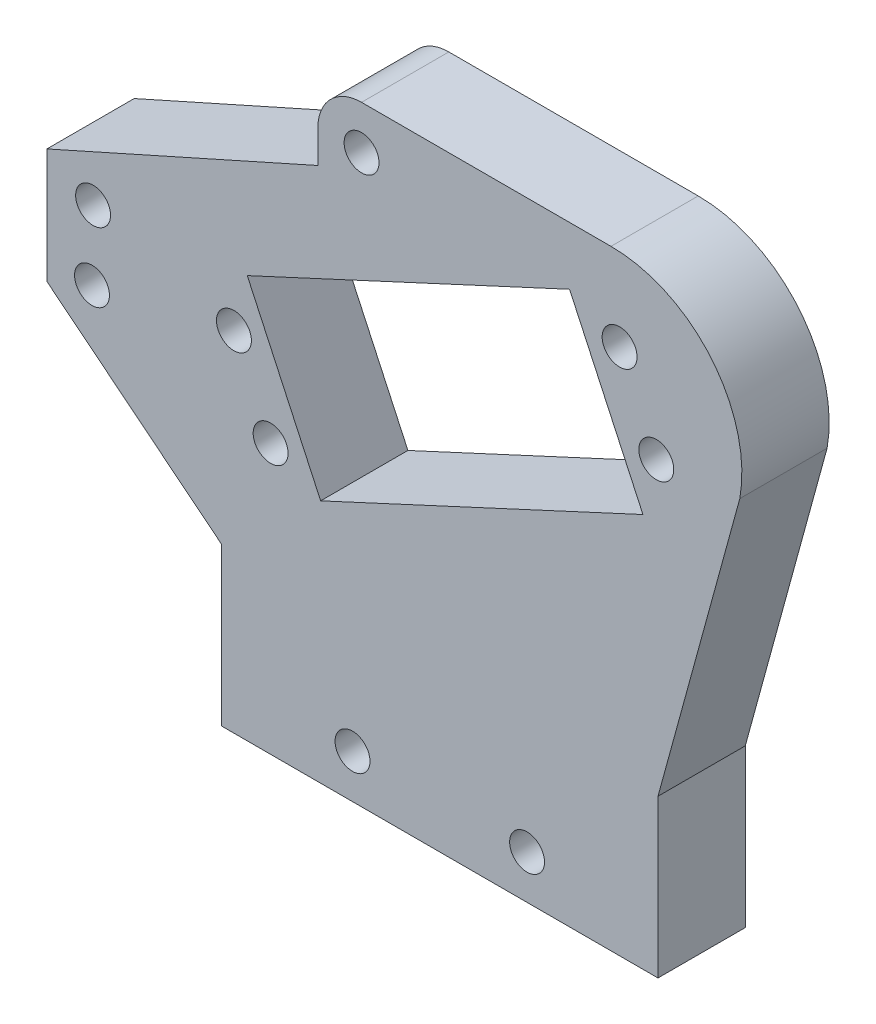
ISO-10303-21;
HEADER;
FILE_DESCRIPTION(('STEP AP214'),'2;1');
FILE_NAME('part.step','',(''),(''),'','','');
FILE_SCHEMA(('AUTOMOTIVE_DESIGN { 1 0 10303 214 1 1 1 1 }'));
ENDSEC;
DATA;
#1=APPLICATION_CONTEXT('core data for automotive mechanical design processes');
#2=APPLICATION_PROTOCOL_DEFINITION('international standard','automotive_design',2000,#1);
#3=PRODUCT_CONTEXT('',#1,'mechanical');
#4=PRODUCT('Part','Part','',(#3));
#5=PRODUCT_RELATED_PRODUCT_CATEGORY('part','',(#4));
#6=PRODUCT_DEFINITION_FORMATION('','',#4);
#7=PRODUCT_DEFINITION_CONTEXT('part definition',#1,'design');
#8=PRODUCT_DEFINITION('design','',#6,#7);
#9=PRODUCT_DEFINITION_SHAPE('','',#8);
#10=(LENGTH_UNIT() NAMED_UNIT(*) SI_UNIT(.MILLI.,.METRE.));
#11=(NAMED_UNIT(*) PLANE_ANGLE_UNIT() SI_UNIT($,.RADIAN.));
#12=(NAMED_UNIT(*) SI_UNIT($,.STERADIAN.) SOLID_ANGLE_UNIT());
#13=UNCERTAINTY_MEASURE_WITH_UNIT(LENGTH_MEASURE(1.E-05),#10,'distance_accuracy_value','');
#14=(GEOMETRIC_REPRESENTATION_CONTEXT(3) GLOBAL_UNCERTAINTY_ASSIGNED_CONTEXT((#13)) GLOBAL_UNIT_ASSIGNED_CONTEXT((#10,
#11,#12)) REPRESENTATION_CONTEXT('',''));
#15=CARTESIAN_POINT('',(0.,0.,0.));
#16=DIRECTION('',(0.,0.,1.));
#17=DIRECTION('',(1.,0.,0.));
#18=AXIS2_PLACEMENT_3D('',#15,#16,#17);
#19=CARTESIAN_POINT('',(0.,-50.,10.));
#20=DIRECTION('',(0.,-1.,0.));
#21=DIRECTION('',(1.,0.,0.));
#22=AXIS2_PLACEMENT_3D('',#19,#20,#21);
#23=PLANE('',#22);
#24=DIRECTION('',(-1.,0.,0.));
#25=VECTOR('',#24,1.);
#26=CARTESIAN_POINT('',(0.,-50.,0.));
#27=LINE('',#26,#25);
#28=CARTESIAN_POINT('',(15.,-50.,0.));
#29=VERTEX_POINT('',#28);
#30=CARTESIAN_POINT('',(-35.,-50.,0.));
#31=VERTEX_POINT('',#30);
#32=EDGE_CURVE('E174',#29,#31,#27,.T.);
#33=ORIENTED_EDGE('',*,*,#32,.F.);
#34=DIRECTION('',(0.,0.,-1.));
#35=VECTOR('',#34,1.);
#36=CARTESIAN_POINT('',(15.,-50.,10.));
#37=LINE('',#36,#35);
#38=CARTESIAN_POINT('',(15.,-50.,10.));
#39=VERTEX_POINT('',#38);
#40=EDGE_CURVE('E11',#39,#29,#37,.T.);
#41=ORIENTED_EDGE('',*,*,#40,.F.);
#42=DIRECTION('',(-1.,0.,0.));
#43=VECTOR('',#42,1.);
#44=CARTESIAN_POINT('',(0.,-50.,10.));
#45=LINE('',#44,#43);
#46=CARTESIAN_POINT('',(-35.,-50.,10.));
#47=VERTEX_POINT('',#46);
#48=EDGE_CURVE('E178',#39,#47,#45,.T.);
#49=ORIENTED_EDGE('',*,*,#48,.T.);
#50=DIRECTION('',(0.,0.,-1.));
#51=VECTOR('',#50,1.);
#52=CARTESIAN_POINT('',(-35.,-50.,10.));
#53=LINE('',#52,#51);
#54=EDGE_CURVE('E225',#47,#31,#53,.T.);
#55=ORIENTED_EDGE('',*,*,#54,.T.);
#56=EDGE_LOOP('',(#33,#41,#49,#55));
#57=FACE_BOUND('',#56,.T.);
#58=ADVANCED_FACE('F34',(#57),#23,.T.);
#59=CARTESIAN_POINT('',(15.,0.,10.));
#60=DIRECTION('',(-1.,0.,0.));
#61=DIRECTION('',(0.,0.,1.));
#62=AXIS2_PLACEMENT_3D('',#59,#60,#61);
#63=PLANE('',#62);
#64=DIRECTION('',(0.,1.,0.));
#65=VECTOR('',#64,1.);
#66=CARTESIAN_POINT('',(15.,0.,0.));
#67=LINE('',#66,#65);
#68=CARTESIAN_POINT('',(15.,-31.9648900169205,0.));
#69=VERTEX_POINT('',#68);
#70=EDGE_CURVE('E228',#29,#69,#67,.T.);
#71=ORIENTED_EDGE('',*,*,#70,.T.);
#72=DIRECTION('',(0.,0.,-1.));
#73=VECTOR('',#72,1.);
#74=CARTESIAN_POINT('',(15.,-31.9648900169205,10.));
#75=LINE('',#74,#73);
#76=CARTESIAN_POINT('',(15.,-31.9648900169205,10.));
#77=VERTEX_POINT('',#76);
#78=EDGE_CURVE('E41',#77,#69,#75,.T.);
#79=ORIENTED_EDGE('',*,*,#78,.F.);
#80=DIRECTION('',(0.,1.,0.));
#81=VECTOR('',#80,1.);
#82=CARTESIAN_POINT('',(15.,0.,10.));
#83=LINE('',#82,#81);
#84=EDGE_CURVE('E181',#39,#77,#83,.T.);
#85=ORIENTED_EDGE('',*,*,#84,.F.);
#86=ORIENTED_EDGE('',*,*,#40,.T.);
#87=EDGE_LOOP('',(#71,#79,#85,#86));
#88=FACE_BOUND('',#87,.T.);
#89=ADVANCED_FACE('F336',(#88),#63,.F.);
#90=CARTESIAN_POINT('',(22.0984528948861,-6.05401504575989,10.));
#91=DIRECTION('',(-0.964462241959494,0.264220710457123,0.));
#92=DIRECTION('',(-0.264220710457123,-0.964462241959494,0.));
#93=AXIS2_PLACEMENT_3D('',#90,#91,#92);
#94=PLANE('',#93);
#95=DIRECTION('',(0.264220710457123,0.964462241959494,0.));
#96=VECTOR('',#95,1.);
#97=CARTESIAN_POINT('',(22.0984528948861,-6.05401504575989,0.));
#98=LINE('',#97,#96);
#99=CARTESIAN_POINT('',(24.3763071489283,2.26064135233112,0.));
#100=VERTEX_POINT('',#99);
#101=EDGE_CURVE('E230',#69,#100,#98,.T.);
#102=ORIENTED_EDGE('',*,*,#101,.T.);
#103=DIRECTION('',(0.,0.,-1.));
#104=VECTOR('',#103,1.);
#105=CARTESIAN_POINT('',(24.3763071489283,2.26064135233112,10.));
#106=LINE('',#105,#104);
#107=CARTESIAN_POINT('',(24.3763071489283,2.26064135233112,10.));
#108=VERTEX_POINT('',#107);
#109=EDGE_CURVE('E286',#108,#100,#106,.T.);
#110=ORIENTED_EDGE('',*,*,#109,.F.);
#111=DIRECTION('',(0.264220710457123,0.964462241959494,0.));
#112=VECTOR('',#111,1.);
#113=CARTESIAN_POINT('',(22.0984528948861,-6.05401504575989,10.));
#114=LINE('',#113,#112);
#115=EDGE_CURVE('E184',#77,#108,#114,.T.);
#116=ORIENTED_EDGE('',*,*,#115,.F.);
#117=ORIENTED_EDGE('',*,*,#78,.T.);
#118=EDGE_LOOP('',(#102,#110,#116,#117));
#119=FACE_BOUND('',#118,.T.);
#120=ADVANCED_FACE('F292',(#119),#94,.F.);
#121=CARTESIAN_POINT('',(9.61205201568624,4.90956006768191,10.));
#122=DIRECTION('',(0.,0.,-1.));
#123=DIRECTION('',(-1.,0.,0.));
#124=AXIS2_PLACEMENT_3D('',#121,#122,#123);
#125=CYLINDRICAL_SURFACE('',#124,15.);
#126=CARTESIAN_POINT('',(9.61205201568624,4.90956006768191,0.));
#127=DIRECTION('',(0.,0.,1.));
#128=DIRECTION('',(1.,0.,0.));
#129=AXIS2_PLACEMENT_3D('',#126,#127,#128);
#130=CIRCLE('',#129,15.);
#131=CARTESIAN_POINT('',(9.61205201568612,19.9095600676819,0.));
#132=VERTEX_POINT('',#131);
#133=EDGE_CURVE('E233',#132,#100,#130,.F.);
#134=ORIENTED_EDGE('',*,*,#133,.F.);
#135=DIRECTION('',(0.,0.,-1.));
#136=VECTOR('',#135,1.);
#137=CARTESIAN_POINT('',(9.61205201568612,19.9095600676819,10.));
#138=LINE('',#137,#136);
#139=CARTESIAN_POINT('',(9.61205201568612,19.9095600676819,10.));
#140=VERTEX_POINT('',#139);
#141=EDGE_CURVE('E284',#140,#132,#138,.T.);
#142=ORIENTED_EDGE('',*,*,#141,.F.);
#143=CARTESIAN_POINT('',(9.61205201568624,4.90956006768191,10.));
#144=DIRECTION('',(0.,0.,1.));
#145=DIRECTION('',(1.,0.,0.));
#146=AXIS2_PLACEMENT_3D('',#143,#144,#145);
#147=CIRCLE('',#146,15.);
#148=EDGE_CURVE('E186',#140,#108,#147,.F.);
#149=ORIENTED_EDGE('',*,*,#148,.T.);
#150=ORIENTED_EDGE('',*,*,#109,.T.);
#151=EDGE_LOOP('',(#134,#142,#149,#150));
#152=FACE_BOUND('',#151,.T.);
#153=ADVANCED_FACE('F302',(#152),#125,.T.);
#154=CARTESIAN_POINT('',(0.,19.9095600676819,10.));
#155=DIRECTION('',(0.,1.,0.));
#156=DIRECTION('',(0.,0.,1.));
#157=AXIS2_PLACEMENT_3D('',#154,#155,#156);
#158=PLANE('',#157);
#159=DIRECTION('',(1.,0.,0.));
#160=VECTOR('',#159,1.);
#161=CARTESIAN_POINT('',(0.,19.9095600676819,0.));
#162=LINE('',#161,#160);
#163=CARTESIAN_POINT('',(-18.966361252115,19.9095600676819,0.));
#164=VERTEX_POINT('',#163);
#165=EDGE_CURVE('E236',#164,#132,#162,.T.);
#166=ORIENTED_EDGE('',*,*,#165,.F.);
#167=DIRECTION('',(0.,0.,-1.));
#168=VECTOR('',#167,1.);
#169=CARTESIAN_POINT('',(-18.966361252115,19.9095600676819,10.));
#170=LINE('',#169,#168);
#171=CARTESIAN_POINT('',(-18.966361252115,19.9095600676819,10.));
#172=VERTEX_POINT('',#171);
#173=EDGE_CURVE('E282',#172,#164,#170,.T.);
#174=ORIENTED_EDGE('',*,*,#173,.F.);
#175=DIRECTION('',(1.,0.,0.));
#176=VECTOR('',#175,1.);
#177=CARTESIAN_POINT('',(0.,19.9095600676819,10.));
#178=LINE('',#177,#176);
#179=EDGE_CURVE('E189',#172,#140,#178,.T.);
#180=ORIENTED_EDGE('',*,*,#179,.T.);
#181=ORIENTED_EDGE('',*,*,#141,.T.);
#182=EDGE_LOOP('',(#166,#174,#180,#181));
#183=FACE_BOUND('',#182,.T.);
#184=ADVANCED_FACE('F311',(#183),#158,.T.);
#185=CARTESIAN_POINT('',(-18.966361252115,14.9095600676819,10.));
#186=DIRECTION('',(0.,0.,-1.));
#187=DIRECTION('',(-1.,0.,0.));
#188=AXIS2_PLACEMENT_3D('',#185,#186,#187);
#189=CYLINDRICAL_SURFACE('',#188,5.);
#190=CARTESIAN_POINT('',(-18.966361252115,14.9095600676819,0.));
#191=DIRECTION('',(0.,0.,1.));
#192=DIRECTION('',(1.,0.,0.));
#193=AXIS2_PLACEMENT_3D('',#190,#191,#192);
#194=CIRCLE('',#193,5.);
#195=CARTESIAN_POINT('',(-23.966361252115,14.9095600676819,0.));
#196=VERTEX_POINT('',#195);
#197=EDGE_CURVE('E239',#196,#164,#194,.F.);
#198=ORIENTED_EDGE('',*,*,#197,.F.);
#199=DIRECTION('',(0.,0.,-1.));
#200=VECTOR('',#199,1.);
#201=CARTESIAN_POINT('',(-23.966361252115,14.9095600676819,10.));
#202=LINE('',#201,#200);
#203=CARTESIAN_POINT('',(-23.966361252115,14.9095600676819,10.));
#204=VERTEX_POINT('',#203);
#205=EDGE_CURVE('E280',#204,#196,#202,.T.);
#206=ORIENTED_EDGE('',*,*,#205,.F.);
#207=CARTESIAN_POINT('',(-18.966361252115,14.9095600676819,10.));
#208=DIRECTION('',(0.,0.,1.));
#209=DIRECTION('',(1.,0.,0.));
#210=AXIS2_PLACEMENT_3D('',#207,#208,#209);
#211=CIRCLE('',#210,5.);
#212=EDGE_CURVE('E192',#204,#172,#211,.F.);
#213=ORIENTED_EDGE('',*,*,#212,.T.);
#214=ORIENTED_EDGE('',*,*,#173,.T.);
#215=EDGE_LOOP('',(#198,#206,#213,#214));
#216=FACE_BOUND('',#215,.T.);
#217=ADVANCED_FACE('F314',(#216),#189,.T.);
#218=CARTESIAN_POINT('',(-23.966361252115,0.,10.));
#219=DIRECTION('',(-1.,0.,0.));
#220=DIRECTION('',(0.,0.,1.));
#221=AXIS2_PLACEMENT_3D('',#218,#219,#220);
#222=PLANE('',#221);
#223=DIRECTION('',(0.,1.,0.));
#224=VECTOR('',#223,1.);
#225=CARTESIAN_POINT('',(-23.966361252115,0.,0.));
#226=LINE('',#225,#224);
#227=CARTESIAN_POINT('',(-23.966361252115,11.1420473773266,0.));
#228=VERTEX_POINT('',#227);
#229=EDGE_CURVE('E242',#228,#196,#226,.T.);
#230=ORIENTED_EDGE('',*,*,#229,.F.);
#231=DIRECTION('',(0.,0.,-1.));
#232=VECTOR('',#231,1.);
#233=CARTESIAN_POINT('',(-23.966361252115,11.1420473773266,10.));
#234=LINE('',#233,#232);
#235=CARTESIAN_POINT('',(-23.966361252115,11.1420473773266,10.));
#236=VERTEX_POINT('',#235);
#237=EDGE_CURVE('E278',#236,#228,#234,.T.);
#238=ORIENTED_EDGE('',*,*,#237,.F.);
#239=DIRECTION('',(0.,1.,0.));
#240=VECTOR('',#239,1.);
#241=CARTESIAN_POINT('',(-23.966361252115,0.,10.));
#242=LINE('',#241,#240);
#243=EDGE_CURVE('E195',#236,#204,#242,.T.);
#244=ORIENTED_EDGE('',*,*,#243,.T.);
#245=ORIENTED_EDGE('',*,*,#205,.T.);
#246=EDGE_LOOP('',(#230,#238,#244,#245));
#247=FACE_BOUND('',#246,.T.);
#248=ADVANCED_FACE('F319',(#247),#222,.T.);
#249=CARTESIAN_POINT('',(-8.1435273591901,18.2157848823989,10.));
#250=DIRECTION('',(-0.408130541250124,0.912923579112119,0.));
#251=DIRECTION('',(-0.912923579112119,-0.408130541250124,0.));
#252=AXIS2_PLACEMENT_3D('',#249,#250,#251);
#253=PLANE('',#252);
#254=DIRECTION('',(0.912923579112119,0.408130541250124,0.));
#255=VECTOR('',#254,1.);
#256=CARTESIAN_POINT('',(-8.1435273591901,18.2157848823989,0.));
#257=LINE('',#256,#255);
#258=CARTESIAN_POINT('',(-55.0179686971235,-2.73984771573603,0.));
#259=VERTEX_POINT('',#258);
#260=EDGE_CURVE('E245',#259,#228,#257,.T.);
#261=ORIENTED_EDGE('',*,*,#260,.F.);
#262=DIRECTION('',(0.,0.,-1.));
#263=VECTOR('',#262,1.);
#264=CARTESIAN_POINT('',(-55.0179686971235,-2.73984771573603,10.));
#265=LINE('',#264,#263);
#266=CARTESIAN_POINT('',(-55.0179686971235,-2.73984771573603,10.));
#267=VERTEX_POINT('',#266);
#268=EDGE_CURVE('E276',#267,#259,#265,.T.);
#269=ORIENTED_EDGE('',*,*,#268,.F.);
#270=DIRECTION('',(0.912923579112119,0.408130541250124,0.));
#271=VECTOR('',#270,1.);
#272=CARTESIAN_POINT('',(-8.1435273591901,18.2157848823989,10.));
#273=LINE('',#272,#271);
#274=EDGE_CURVE('E198',#267,#236,#273,.T.);
#275=ORIENTED_EDGE('',*,*,#274,.T.);
#276=ORIENTED_EDGE('',*,*,#237,.T.);
#277=EDGE_LOOP('',(#261,#269,#275,#276));
#278=FACE_BOUND('',#277,.T.);
#279=ADVANCED_FACE('F322',(#278),#253,.T.);
#280=CARTESIAN_POINT('',(-55.0179686971235,0.,10.));
#281=DIRECTION('',(-1.,0.,0.));
#282=DIRECTION('',(0.,0.,1.));
#283=AXIS2_PLACEMENT_3D('',#280,#281,#282);
#284=PLANE('',#283);
#285=DIRECTION('',(0.,1.,0.));
#286=VECTOR('',#285,1.);
#287=CARTESIAN_POINT('',(-55.0179686971235,0.,0.));
#288=LINE('',#287,#286);
#289=CARTESIAN_POINT('',(-55.0179686971235,-15.891116751269,0.));
#290=VERTEX_POINT('',#289);
#291=EDGE_CURVE('E248',#290,#259,#288,.T.);
#292=ORIENTED_EDGE('',*,*,#291,.F.);
#293=DIRECTION('',(0.,0.,-1.));
#294=VECTOR('',#293,1.);
#295=CARTESIAN_POINT('',(-55.0179686971235,-15.891116751269,10.));
#296=LINE('',#295,#294);
#297=CARTESIAN_POINT('',(-55.0179686971235,-15.891116751269,10.));
#298=VERTEX_POINT('',#297);
#299=EDGE_CURVE('E274',#298,#290,#296,.T.);
#300=ORIENTED_EDGE('',*,*,#299,.F.);
#301=DIRECTION('',(0.,1.,0.));
#302=VECTOR('',#301,1.);
#303=CARTESIAN_POINT('',(-55.0179686971235,0.,10.));
#304=LINE('',#303,#302);
#305=EDGE_CURVE('E201',#298,#267,#304,.T.);
#306=ORIENTED_EDGE('',*,*,#305,.T.);
#307=ORIENTED_EDGE('',*,*,#268,.T.);
#308=EDGE_LOOP('',(#292,#300,#306,#307));
#309=FACE_BOUND('',#308,.T.);
#310=ADVANCED_FACE('F327',(#309),#284,.T.);
#311=CARTESIAN_POINT('',(-29.32545745957,-36.5213618328781,10.));
#312=DIRECTION('',(-0.626104808452477,-0.779738910682728,0.));
#313=DIRECTION('',(0.779738910682728,-0.626104808452477,0.));
#314=AXIS2_PLACEMENT_3D('',#311,#312,#313);
#315=PLANE('',#314);
#316=DIRECTION('',(-0.779738910682728,0.626104808452477,0.));
#317=VECTOR('',#316,1.);
#318=CARTESIAN_POINT('',(-29.32545745957,-36.5213618328781,0.));
#319=LINE('',#318,#317);
#320=CARTESIAN_POINT('',(-35.,-31.9648900169205,0.));
#321=VERTEX_POINT('',#320);
#322=EDGE_CURVE('E251',#321,#290,#319,.T.);
#323=ORIENTED_EDGE('',*,*,#322,.F.);
#324=DIRECTION('',(0.,0.,-1.));
#325=VECTOR('',#324,1.);
#326=CARTESIAN_POINT('',(-35.,-31.9648900169205,10.));
#327=LINE('',#326,#325);
#328=CARTESIAN_POINT('',(-35.,-31.9648900169205,10.));
#329=VERTEX_POINT('',#328);
#330=EDGE_CURVE('E272',#329,#321,#327,.T.);
#331=ORIENTED_EDGE('',*,*,#330,.F.);
#332=DIRECTION('',(-0.779738910682728,0.626104808452477,0.));
#333=VECTOR('',#332,1.);
#334=CARTESIAN_POINT('',(-29.32545745957,-36.5213618328781,10.));
#335=LINE('',#334,#333);
#336=EDGE_CURVE('E204',#329,#298,#335,.T.);
#337=ORIENTED_EDGE('',*,*,#336,.T.);
#338=ORIENTED_EDGE('',*,*,#299,.T.);
#339=EDGE_LOOP('',(#323,#331,#337,#338));
#340=FACE_BOUND('',#339,.T.);
#341=ADVANCED_FACE('F330',(#340),#315,.T.);
#342=CARTESIAN_POINT('',(-49.7259072336343,-5.68993613292802,10.));
#343=DIRECTION('',(0.,0.,-1.));
#344=DIRECTION('',(-1.,0.,0.));
#345=AXIS2_PLACEMENT_3D('',#342,#343,#344);
#346=CYLINDRICAL_SURFACE('',#345,2.);
#347=CARTESIAN_POINT('',(-49.7259072336343,-5.68993613292802,10.));
#348=DIRECTION('',(0.,0.,1.));
#349=DIRECTION('',(1.,0.,0.));
#350=AXIS2_PLACEMENT_3D('',#347,#348,#349);
#351=CIRCLE('',#350,2.);
#352=CARTESIAN_POINT('',(-47.7259072336343,-5.68993613292802,10.));
#353=VERTEX_POINT('',#352);
#354=EDGE_CURVE('E219',#353,#353,#351,.T.);
#355=ORIENTED_EDGE('',*,*,#354,.T.);
#356=EDGE_LOOP('',(#355));
#357=FACE_BOUND('',#356,.T.);
#358=CARTESIAN_POINT('',(-49.7259072336343,-5.68993613292802,0.));
#359=DIRECTION('',(0.,0.,1.));
#360=DIRECTION('',(1.,0.,0.));
#361=AXIS2_PLACEMENT_3D('',#358,#359,#360);
#362=CIRCLE('',#361,2.);
#363=CARTESIAN_POINT('',(-47.7259072336343,-5.68993613292802,0.));
#364=VERTEX_POINT('',#363);
#365=EDGE_CURVE('E266',#364,#364,#362,.T.);
#366=ORIENTED_EDGE('',*,*,#365,.F.);
#367=EDGE_LOOP('',(#366));
#368=FACE_BOUND('',#367,.T.);
#369=ADVANCED_FACE('F358',(#357,#368),#346,.F.);
#370=CARTESIAN_POINT('',(-49.8507689611168,-13.6889616703926,10.));
#371=DIRECTION('',(0.,0.,-1.));
#372=DIRECTION('',(-1.,0.,0.));
#373=AXIS2_PLACEMENT_3D('',#370,#371,#372);
#374=CYLINDRICAL_SURFACE('',#373,2.);
#375=CARTESIAN_POINT('',(-49.8507689611168,-13.6889616703926,10.));
#376=DIRECTION('',(0.,0.,1.));
#377=DIRECTION('',(1.,0.,0.));
#378=AXIS2_PLACEMENT_3D('',#375,#376,#377);
#379=CIRCLE('',#378,2.);
#380=CARTESIAN_POINT('',(-47.8507689611168,-13.6889616703926,10.));
#381=VERTEX_POINT('',#380);
#382=EDGE_CURVE('E216',#381,#381,#379,.T.);
#383=ORIENTED_EDGE('',*,*,#382,.T.);
#384=EDGE_LOOP('',(#383));
#385=FACE_BOUND('',#384,.T.);
#386=CARTESIAN_POINT('',(-49.8507689611168,-13.6889616703926,0.));
#387=DIRECTION('',(0.,0.,1.));
#388=DIRECTION('',(1.,0.,0.));
#389=AXIS2_PLACEMENT_3D('',#386,#387,#388);
#390=CIRCLE('',#389,2.);
#391=CARTESIAN_POINT('',(-47.8507689611168,-13.6889616703926,0.));
#392=VERTEX_POINT('',#391);
#393=EDGE_CURVE('E263',#392,#392,#390,.T.);
#394=ORIENTED_EDGE('',*,*,#393,.F.);
#395=EDGE_LOOP('',(#394));
#396=FACE_BOUND('',#395,.T.);
#397=ADVANCED_FACE('F369',(#385,#396),#374,.F.);
#398=CARTESIAN_POINT('',(-18.966361252115,14.9095600676819,10.));
#399=DIRECTION('',(0.,0.,-1.));
#400=DIRECTION('',(-1.,0.,0.));
#401=AXIS2_PLACEMENT_3D('',#398,#399,#400);
#402=CYLINDRICAL_SURFACE('',#401,2.);
#403=CARTESIAN_POINT('',(-18.966361252115,14.9095600676819,10.));
#404=DIRECTION('',(0.,0.,1.));
#405=DIRECTION('',(1.,0.,0.));
#406=AXIS2_PLACEMENT_3D('',#403,#404,#405);
#407=CIRCLE('',#406,2.);
#408=CARTESIAN_POINT('',(-16.966361252115,14.9095600676819,10.));
#409=VERTEX_POINT('',#408);
#410=EDGE_CURVE('E213',#409,#409,#407,.T.);
#411=ORIENTED_EDGE('',*,*,#410,.T.);
#412=EDGE_LOOP('',(#411));
#413=FACE_BOUND('',#412,.T.);
#414=CARTESIAN_POINT('',(-18.966361252115,14.9095600676819,0.));
#415=DIRECTION('',(0.,0.,1.));
#416=DIRECTION('',(1.,0.,0.));
#417=AXIS2_PLACEMENT_3D('',#414,#415,#416);
#418=CIRCLE('',#417,2.);
#419=CARTESIAN_POINT('',(-16.966361252115,14.9095600676819,0.));
#420=VERTEX_POINT('',#419);
#421=EDGE_CURVE('E260',#420,#420,#418,.T.);
#422=ORIENTED_EDGE('',*,*,#421,.F.);
#423=EDGE_LOOP('',(#422));
#424=FACE_BOUND('',#423,.T.);
#425=ADVANCED_FACE('F365',(#413,#424),#402,.F.);
#426=CARTESIAN_POINT('',(0.,-45.,10.));
#427=DIRECTION('',(0.,0.,-1.));
#428=DIRECTION('',(-1.,0.,0.));
#429=AXIS2_PLACEMENT_3D('',#426,#427,#428);
#430=CYLINDRICAL_SURFACE('',#429,2.);
#431=CARTESIAN_POINT('',(0.,-45.,10.));
#432=DIRECTION('',(0.,0.,1.));
#433=DIRECTION('',(1.,0.,0.));
#434=AXIS2_PLACEMENT_3D('',#431,#432,#433);
#435=CIRCLE('',#434,2.);
#436=CARTESIAN_POINT('',(2.00000000000001,-45.,10.));
#437=VERTEX_POINT('',#436);
#438=EDGE_CURVE('E210',#437,#437,#435,.T.);
#439=ORIENTED_EDGE('',*,*,#438,.T.);
#440=EDGE_LOOP('',(#439));
#441=FACE_BOUND('',#440,.T.);
#442=CARTESIAN_POINT('',(0.,-45.,0.));
#443=DIRECTION('',(0.,0.,1.));
#444=DIRECTION('',(1.,0.,0.));
#445=AXIS2_PLACEMENT_3D('',#442,#443,#444);
#446=CIRCLE('',#445,2.);
#447=CARTESIAN_POINT('',(2.00000000000001,-45.,0.));
#448=VERTEX_POINT('',#447);
#449=EDGE_CURVE('E257',#448,#448,#446,.T.);
#450=ORIENTED_EDGE('',*,*,#449,.F.);
#451=EDGE_LOOP('',(#450));
#452=FACE_BOUND('',#451,.T.);
#453=ADVANCED_FACE('F362',(#441,#452),#430,.F.);
#454=CARTESIAN_POINT('',(-35.,0.,10.));
#455=DIRECTION('',(-1.,0.,0.));
#456=DIRECTION('',(0.,0.,1.));
#457=AXIS2_PLACEMENT_3D('',#454,#455,#456);
#458=PLANE('',#457);
#459=DIRECTION('',(0.,1.,0.));
#460=VECTOR('',#459,1.);
#461=CARTESIAN_POINT('',(-35.,0.,0.));
#462=LINE('',#461,#460);
#463=EDGE_CURVE('E254',#31,#321,#462,.T.);
#464=ORIENTED_EDGE('',*,*,#463,.F.);
#465=ORIENTED_EDGE('',*,*,#54,.F.);
#466=DIRECTION('',(0.,1.,0.));
#467=VECTOR('',#466,1.);
#468=CARTESIAN_POINT('',(-35.,0.,10.));
#469=LINE('',#468,#467);
#470=EDGE_CURVE('E207',#47,#329,#469,.T.);
#471=ORIENTED_EDGE('',*,*,#470,.T.);
#472=ORIENTED_EDGE('',*,*,#330,.T.);
#473=EDGE_LOOP('',(#464,#465,#471,#472));
#474=FACE_BOUND('',#473,.T.);
#475=ADVANCED_FACE('F334',(#474),#458,.T.);
#476=CARTESIAN_POINT('',(-20.,-45.,10.));
#477=DIRECTION('',(0.,0.,-1.));
#478=DIRECTION('',(-1.,0.,0.));
#479=AXIS2_PLACEMENT_3D('',#476,#477,#478);
#480=CYLINDRICAL_SURFACE('',#479,2.);
#481=CARTESIAN_POINT('',(-20.,-45.,10.));
#482=DIRECTION('',(0.,0.,1.));
#483=DIRECTION('',(1.,0.,0.));
#484=AXIS2_PLACEMENT_3D('',#481,#482,#483);
#485=CIRCLE('',#484,2.);
#486=CARTESIAN_POINT('',(-18.,-45.,10.));
#487=VERTEX_POINT('',#486);
#488=EDGE_CURVE('E222',#487,#487,#485,.T.);
#489=ORIENTED_EDGE('',*,*,#488,.T.);
#490=EDGE_LOOP('',(#489));
#491=FACE_BOUND('',#490,.T.);
#492=CARTESIAN_POINT('',(-20.,-45.,0.));
#493=DIRECTION('',(0.,0.,1.));
#494=DIRECTION('',(1.,0.,0.));
#495=AXIS2_PLACEMENT_3D('',#492,#493,#494);
#496=CIRCLE('',#495,2.);
#497=CARTESIAN_POINT('',(-18.,-45.,0.));
#498=VERTEX_POINT('',#497);
#499=EDGE_CURVE('E182',#498,#498,#496,.T.);
#500=ORIENTED_EDGE('',*,*,#499,.F.);
#501=EDGE_LOOP('',(#500));
#502=FACE_BOUND('',#501,.T.);
#503=ADVANCED_FACE('F361',(#491,#502),#480,.F.);
#504=CARTESIAN_POINT('',(0.,0.,10.));
#505=DIRECTION('',(0.,0.,1.));
#506=DIRECTION('',(1.,0.,0.));
#507=AXIS2_PLACEMENT_3D('',#504,#505,#506);
#508=PLANE('',#507);
#509=CARTESIAN_POINT('',(10.6013869918596,10.4216406505323,10.));
#510=DIRECTION('',(0.,0.,1.));
#511=DIRECTION('',(1.,0.,0.));
#512=AXIS2_PLACEMENT_3D('',#509,#510,#511);
#513=CIRCLE('',#512,2.);
#514=CARTESIAN_POINT('',(12.6013869918596,10.4216406505323,10.));
#515=VERTEX_POINT('',#514);
#516=EDGE_CURVE('E421',#515,#515,#513,.T.);
#517=ORIENTED_EDGE('',*,*,#516,.F.);
#518=EDGE_LOOP('',(#517));
#519=FACE_BOUND('',#518,.T.);
#520=CARTESIAN_POINT('',(14.8048274510521,1.34799263520657,10.));
#521=DIRECTION('',(0.,0.,1.));
#522=DIRECTION('',(1.,0.,0.));
#523=AXIS2_PLACEMENT_3D('',#520,#521,#522);
#524=CIRCLE('',#523,2.);
#525=CARTESIAN_POINT('',(16.8048274510521,1.34799263520657,10.));
#526=VERTEX_POINT('',#525);
#527=EDGE_CURVE('E425',#526,#526,#524,.T.);
#528=ORIENTED_EDGE('',*,*,#527,.F.);
#529=EDGE_LOOP('',(#528));
#530=FACE_BOUND('',#529,.T.);
#531=CARTESIAN_POINT('',(-29.3838383835841,-19.1227624010607,10.));
#532=DIRECTION('',(0.,0.,1.));
#533=DIRECTION('',(1.,0.,0.));
#534=AXIS2_PLACEMENT_3D('',#531,#532,#533);
#535=CIRCLE('',#534,2.);
#536=CARTESIAN_POINT('',(-27.3838383835841,-19.1227624010607,10.));
#537=VERTEX_POINT('',#536);
#538=EDGE_CURVE('E432',#537,#537,#535,.T.);
#539=ORIENTED_EDGE('',*,*,#538,.F.);
#540=EDGE_LOOP('',(#539));
#541=FACE_BOUND('',#540,.T.);
#542=CARTESIAN_POINT('',(-33.5872788427765,-10.0491143857351,10.));
#543=DIRECTION('',(0.,0.,1.));
#544=DIRECTION('',(1.,0.,0.));
#545=AXIS2_PLACEMENT_3D('',#542,#543,#544);
#546=CIRCLE('',#545,2.);
#547=CARTESIAN_POINT('',(-31.5872788427765,-10.0491143857351,10.));
#548=VERTEX_POINT('',#547);
#549=EDGE_CURVE('E161',#548,#548,#546,.T.);
#550=ORIENTED_EDGE('',*,*,#549,.F.);
#551=EDGE_LOOP('',(#550));
#552=FACE_BOUND('',#551,.T.);
#553=DIRECTION('',(0.907364801532571,0.420344045919243,0.));
#554=VECTOR('',#553,1.);
#555=CARTESIAN_POINT('',(4.20344045919243,-9.07364801532569,10.));
#556=LINE('',#555,#554);
#557=CARTESIAN_POINT('',(-23.6526589478576,-21.9782102250465,10.));
#558=VERTEX_POINT('',#557);
#559=CARTESIAN_POINT('',(13.277088474518,-4.87020755613332,10.));
#560=VERTEX_POINT('',#559);
#561=EDGE_CURVE('E48',#558,#560,#556,.T.);
#562=ORIENTED_EDGE('',*,*,#561,.F.);
#563=DIRECTION('',(-0.420344045919246,0.907364801532569,0.));
#564=VECTOR('',#563,1.);
#565=CARTESIAN_POINT('',(-27.85609940705,-12.9045622097209,10.));
#566=LINE('',#565,#564);
#567=CARTESIAN_POINT('',(-32.0595398662425,-3.83091419439522,10.));
#568=VERTEX_POINT('',#567);
#569=EDGE_CURVE('E155',#558,#568,#566,.T.);
#570=ORIENTED_EDGE('',*,*,#569,.T.);
#571=DIRECTION('',(0.907364801532569,0.420344045919246,0.));
#572=VECTOR('',#571,1.);
#573=CARTESIAN_POINT('',(-4.20344045919246,9.07364801532569,10.));
#574=LINE('',#573,#572);
#575=CARTESIAN_POINT('',(4.87020755613311,13.2770884745181,10.));
#576=VERTEX_POINT('',#575);
#577=EDGE_CURVE('E158',#568,#576,#574,.T.);
#578=ORIENTED_EDGE('',*,*,#577,.T.);
#579=DIRECTION('',(-0.420344045919246,0.907364801532569,0.));
#580=VECTOR('',#579,1.);
#581=CARTESIAN_POINT('',(9.07364801532556,4.20344045919239,10.));
#582=LINE('',#581,#580);
#583=EDGE_CURVE('E167',#560,#576,#582,.T.);
#584=ORIENTED_EDGE('',*,*,#583,.F.);
#585=EDGE_LOOP('',(#562,#570,#578,#584));
#586=FACE_BOUND('',#585,.T.);
#587=ORIENTED_EDGE('',*,*,#48,.F.);
#588=ORIENTED_EDGE('',*,*,#84,.T.);
#589=ORIENTED_EDGE('',*,*,#115,.T.);
#590=ORIENTED_EDGE('',*,*,#148,.F.);
#591=ORIENTED_EDGE('',*,*,#179,.F.);
#592=ORIENTED_EDGE('',*,*,#212,.F.);
#593=ORIENTED_EDGE('',*,*,#243,.F.);
#594=ORIENTED_EDGE('',*,*,#274,.F.);
#595=ORIENTED_EDGE('',*,*,#305,.F.);
#596=ORIENTED_EDGE('',*,*,#336,.F.);
#597=ORIENTED_EDGE('',*,*,#470,.F.);
#598=EDGE_LOOP('',(#587,#588,#589,#590,#591,#592,#593,#594,#595,#596,#597));
#599=FACE_BOUND('',#598,.T.);
#600=ORIENTED_EDGE('',*,*,#438,.F.);
#601=EDGE_LOOP('',(#600));
#602=FACE_BOUND('',#601,.T.);
#603=ORIENTED_EDGE('',*,*,#410,.F.);
#604=EDGE_LOOP('',(#603));
#605=FACE_BOUND('',#604,.T.);
#606=ORIENTED_EDGE('',*,*,#382,.F.);
#607=EDGE_LOOP('',(#606));
#608=FACE_BOUND('',#607,.T.);
#609=ORIENTED_EDGE('',*,*,#354,.F.);
#610=EDGE_LOOP('',(#609));
#611=FACE_BOUND('',#610,.T.);
#612=ORIENTED_EDGE('',*,*,#488,.F.);
#613=EDGE_LOOP('',(#612));
#614=FACE_BOUND('',#613,.T.);
#615=ADVANCED_FACE('F307',(#519,#530,#541,#552,#586,#599,#602,#605,#608,#611,#614),#508,.T.);
#616=CARTESIAN_POINT('',(0.,0.,0.));
#617=DIRECTION('',(0.,0.,1.));
#618=DIRECTION('',(1.,0.,0.));
#619=AXIS2_PLACEMENT_3D('',#616,#617,#618);
#620=PLANE('',#619);
#621=CARTESIAN_POINT('',(10.6013869918596,10.4216406505323,0.));
#622=DIRECTION('',(0.,0.,1.));
#623=DIRECTION('',(1.,0.,0.));
#624=AXIS2_PLACEMENT_3D('',#621,#622,#623);
#625=CIRCLE('',#624,2.);
#626=CARTESIAN_POINT('',(12.6013869918596,10.4216406505323,0.));
#627=VERTEX_POINT('',#626);
#628=EDGE_CURVE('E418',#627,#627,#625,.T.);
#629=ORIENTED_EDGE('',*,*,#628,.T.);
#630=EDGE_LOOP('',(#629));
#631=FACE_BOUND('',#630,.T.);
#632=CARTESIAN_POINT('',(14.8048274510521,1.34799263520657,0.));
#633=DIRECTION('',(0.,0.,1.));
#634=DIRECTION('',(1.,0.,0.));
#635=AXIS2_PLACEMENT_3D('',#632,#633,#634);
#636=CIRCLE('',#635,2.);
#637=CARTESIAN_POINT('',(16.8048274510521,1.34799263520657,0.));
#638=VERTEX_POINT('',#637);
#639=EDGE_CURVE('E422',#638,#638,#636,.T.);
#640=ORIENTED_EDGE('',*,*,#639,.T.);
#641=EDGE_LOOP('',(#640));
#642=FACE_BOUND('',#641,.T.);
#643=CARTESIAN_POINT('',(-29.3838383835841,-19.1227624010607,0.));
#644=DIRECTION('',(0.,0.,1.));
#645=DIRECTION('',(1.,0.,0.));
#646=AXIS2_PLACEMENT_3D('',#643,#644,#645);
#647=CIRCLE('',#646,2.);
#648=CARTESIAN_POINT('',(-27.3838383835841,-19.1227624010607,0.));
#649=VERTEX_POINT('',#648);
#650=EDGE_CURVE('E430',#649,#649,#647,.T.);
#651=ORIENTED_EDGE('',*,*,#650,.T.);
#652=EDGE_LOOP('',(#651));
#653=FACE_BOUND('',#652,.T.);
#654=CARTESIAN_POINT('',(-33.5872788427765,-10.0491143857351,0.));
#655=DIRECTION('',(0.,0.,1.));
#656=DIRECTION('',(1.,0.,0.));
#657=AXIS2_PLACEMENT_3D('',#654,#655,#656);
#658=CIRCLE('',#657,2.);
#659=CARTESIAN_POINT('',(-31.5872788427765,-10.0491143857351,0.));
#660=VERTEX_POINT('',#659);
#661=EDGE_CURVE('E168',#660,#660,#658,.T.);
#662=ORIENTED_EDGE('',*,*,#661,.T.);
#663=EDGE_LOOP('',(#662));
#664=FACE_BOUND('',#663,.T.);
#665=DIRECTION('',(-0.420344045919246,0.907364801532569,0.));
#666=VECTOR('',#665,1.);
#667=CARTESIAN_POINT('',(-27.85609940705,-12.9045622097209,0.));
#668=LINE('',#667,#666);
#669=CARTESIAN_POINT('',(-23.6526589478576,-21.9782102250465,0.));
#670=VERTEX_POINT('',#669);
#671=CARTESIAN_POINT('',(-32.0595398662425,-3.83091419439522,0.));
#672=VERTEX_POINT('',#671);
#673=EDGE_CURVE('E144',#670,#672,#668,.T.);
#674=ORIENTED_EDGE('',*,*,#673,.F.);
#675=DIRECTION('',(0.907364801532571,0.420344045919243,0.));
#676=VECTOR('',#675,1.);
#677=CARTESIAN_POINT('',(4.20344045919243,-9.07364801532569,0.));
#678=LINE('',#677,#676);
#679=CARTESIAN_POINT('',(13.277088474518,-4.87020755613331,0.));
#680=VERTEX_POINT('',#679);
#681=EDGE_CURVE('E141',#670,#680,#678,.T.);
#682=ORIENTED_EDGE('',*,*,#681,.T.);
#683=DIRECTION('',(-0.420344045919246,0.907364801532569,0.));
#684=VECTOR('',#683,1.);
#685=CARTESIAN_POINT('',(9.07364801532556,4.20344045919239,0.));
#686=LINE('',#685,#684);
#687=CARTESIAN_POINT('',(4.87020755613311,13.2770884745181,0.));
#688=VERTEX_POINT('',#687);
#689=EDGE_CURVE('E147',#680,#688,#686,.T.);
#690=ORIENTED_EDGE('',*,*,#689,.T.);
#691=DIRECTION('',(0.907364801532569,0.420344045919246,0.));
#692=VECTOR('',#691,1.);
#693=CARTESIAN_POINT('',(-4.20344045919246,9.07364801532569,0.));
#694=LINE('',#693,#692);
#695=EDGE_CURVE('E151',#672,#688,#694,.T.);
#696=ORIENTED_EDGE('',*,*,#695,.F.);
#697=EDGE_LOOP('',(#674,#682,#690,#696));
#698=FACE_BOUND('',#697,.T.);
#699=ORIENTED_EDGE('',*,*,#32,.T.);
#700=ORIENTED_EDGE('',*,*,#463,.T.);
#701=ORIENTED_EDGE('',*,*,#322,.T.);
#702=ORIENTED_EDGE('',*,*,#291,.T.);
#703=ORIENTED_EDGE('',*,*,#260,.T.);
#704=ORIENTED_EDGE('',*,*,#229,.T.);
#705=ORIENTED_EDGE('',*,*,#197,.T.);
#706=ORIENTED_EDGE('',*,*,#165,.T.);
#707=ORIENTED_EDGE('',*,*,#133,.T.);
#708=ORIENTED_EDGE('',*,*,#101,.F.);
#709=ORIENTED_EDGE('',*,*,#70,.F.);
#710=EDGE_LOOP('',(#699,#700,#701,#702,#703,#704,#705,#706,#707,#708,#709));
#711=FACE_BOUND('',#710,.T.);
#712=ORIENTED_EDGE('',*,*,#449,.T.);
#713=EDGE_LOOP('',(#712));
#714=FACE_BOUND('',#713,.T.);
#715=ORIENTED_EDGE('',*,*,#421,.T.);
#716=EDGE_LOOP('',(#715));
#717=FACE_BOUND('',#716,.T.);
#718=ORIENTED_EDGE('',*,*,#393,.T.);
#719=EDGE_LOOP('',(#718));
#720=FACE_BOUND('',#719,.T.);
#721=ORIENTED_EDGE('',*,*,#365,.T.);
#722=EDGE_LOOP('',(#721));
#723=FACE_BOUND('',#722,.T.);
#724=ORIENTED_EDGE('',*,*,#499,.T.);
#725=EDGE_LOOP('',(#724));
#726=FACE_BOUND('',#725,.T.);
#727=ADVANCED_FACE('F153',(#631,#642,#653,#664,#698,#711,#714,#717,#720,#723,#726),#620,.F.);
#728=CARTESIAN_POINT('',(4.20344045919243,-9.07364801532569,0.));
#729=DIRECTION('',(0.420344045919243,-0.907364801532571,0.));
#730=DIRECTION('',(0.907364801532571,0.420344045919243,0.));
#731=AXIS2_PLACEMENT_3D('',#728,#729,#730);
#732=PLANE('',#731);
#733=ORIENTED_EDGE('',*,*,#561,.T.);
#734=DIRECTION('',(0.,0.,1.));
#735=VECTOR('',#734,1.);
#736=CARTESIAN_POINT('',(13.277088474518,-4.87020755613331,0.));
#737=LINE('',#736,#735);
#738=EDGE_CURVE('E138',#680,#560,#737,.T.);
#739=ORIENTED_EDGE('',*,*,#738,.F.);
#740=ORIENTED_EDGE('',*,*,#681,.F.);
#741=DIRECTION('',(0.,0.,1.));
#742=VECTOR('',#741,1.);
#743=CARTESIAN_POINT('',(-23.6526589478576,-21.9782102250465,0.));
#744=LINE('',#743,#742);
#745=EDGE_CURVE('E172',#670,#558,#744,.T.);
#746=ORIENTED_EDGE('',*,*,#745,.T.);
#747=EDGE_LOOP('',(#733,#739,#740,#746));
#748=FACE_BOUND('',#747,.T.);
#749=ADVANCED_FACE('F139',(#748),#732,.F.);
#750=CARTESIAN_POINT('',(-27.85609940705,-12.9045622097209,0.));
#751=DIRECTION('',(0.907364801532569,0.420344045919246,0.));
#752=DIRECTION('',(-0.420344045919246,0.907364801532569,0.));
#753=AXIS2_PLACEMENT_3D('',#750,#751,#752);
#754=PLANE('',#753);
#755=ORIENTED_EDGE('',*,*,#569,.F.);
#756=ORIENTED_EDGE('',*,*,#745,.F.);
#757=ORIENTED_EDGE('',*,*,#673,.T.);
#758=DIRECTION('',(0.,0.,1.));
#759=VECTOR('',#758,1.);
#760=CARTESIAN_POINT('',(-32.0595398662425,-3.83091419439522,0.));
#761=LINE('',#760,#759);
#762=EDGE_CURVE('E175',#672,#568,#761,.T.);
#763=ORIENTED_EDGE('',*,*,#762,.T.);
#764=EDGE_LOOP('',(#755,#756,#757,#763));
#765=FACE_BOUND('',#764,.T.);
#766=ADVANCED_FACE('F388',(#765),#754,.T.);
#767=CARTESIAN_POINT('',(-4.20344045919246,9.07364801532569,0.));
#768=DIRECTION('',(0.420344045919246,-0.907364801532569,0.));
#769=DIRECTION('',(0.907364801532569,0.420344045919246,0.));
#770=AXIS2_PLACEMENT_3D('',#767,#768,#769);
#771=PLANE('',#770);
#772=ORIENTED_EDGE('',*,*,#577,.F.);
#773=ORIENTED_EDGE('',*,*,#762,.F.);
#774=ORIENTED_EDGE('',*,*,#695,.T.);
#775=DIRECTION('',(0.,0.,1.));
#776=VECTOR('',#775,1.);
#777=CARTESIAN_POINT('',(4.87020755613311,13.2770884745181,0.));
#778=LINE('',#777,#776);
#779=EDGE_CURVE('E56',#688,#576,#778,.T.);
#780=ORIENTED_EDGE('',*,*,#779,.T.);
#781=EDGE_LOOP('',(#772,#773,#774,#780));
#782=FACE_BOUND('',#781,.T.);
#783=ADVANCED_FACE('F392',(#782),#771,.T.);
#784=CARTESIAN_POINT('',(9.07364801532556,4.20344045919239,0.));
#785=DIRECTION('',(0.90736480153257,0.420344045919246,0.));
#786=DIRECTION('',(-0.420344045919246,0.90736480153257,0.));
#787=AXIS2_PLACEMENT_3D('',#784,#785,#786);
#788=PLANE('',#787);
#789=ORIENTED_EDGE('',*,*,#583,.T.);
#790=ORIENTED_EDGE('',*,*,#779,.F.);
#791=ORIENTED_EDGE('',*,*,#689,.F.);
#792=ORIENTED_EDGE('',*,*,#738,.T.);
#793=EDGE_LOOP('',(#789,#790,#791,#792));
#794=FACE_BOUND('',#793,.T.);
#795=ADVANCED_FACE('F148',(#794),#788,.F.);
#796=CARTESIAN_POINT('',(-33.5872788427765,-10.0491143857351,0.));
#797=DIRECTION('',(0.,0.,1.));
#798=DIRECTION('',(1.,0.,0.));
#799=AXIS2_PLACEMENT_3D('',#796,#797,#798);
#800=CYLINDRICAL_SURFACE('',#799,2.);
#801=ORIENTED_EDGE('',*,*,#661,.F.);
#802=EDGE_LOOP('',(#801));
#803=FACE_BOUND('',#802,.T.);
#804=ORIENTED_EDGE('',*,*,#549,.T.);
#805=EDGE_LOOP('',(#804));
#806=FACE_BOUND('',#805,.T.);
#807=ADVANCED_FACE('F391',(#803,#806),#800,.F.);
#808=CARTESIAN_POINT('',(-29.3838383835841,-19.1227624010607,0.));
#809=DIRECTION('',(0.,0.,1.));
#810=DIRECTION('',(1.,0.,0.));
#811=AXIS2_PLACEMENT_3D('',#808,#809,#810);
#812=CYLINDRICAL_SURFACE('',#811,2.);
#813=ORIENTED_EDGE('',*,*,#650,.F.);
#814=EDGE_LOOP('',(#813));
#815=FACE_BOUND('',#814,.T.);
#816=ORIENTED_EDGE('',*,*,#538,.T.);
#817=EDGE_LOOP('',(#816));
#818=FACE_BOUND('',#817,.T.);
#819=ADVANCED_FACE('F401',(#815,#818),#812,.F.);
#820=CARTESIAN_POINT('',(14.8048274510521,1.34799263520657,0.));
#821=DIRECTION('',(0.,0.,1.));
#822=DIRECTION('',(1.,0.,0.));
#823=AXIS2_PLACEMENT_3D('',#820,#821,#822);
#824=CYLINDRICAL_SURFACE('',#823,2.);
#825=ORIENTED_EDGE('',*,*,#639,.F.);
#826=EDGE_LOOP('',(#825));
#827=FACE_BOUND('',#826,.T.);
#828=ORIENTED_EDGE('',*,*,#527,.T.);
#829=EDGE_LOOP('',(#828));
#830=FACE_BOUND('',#829,.T.);
#831=ADVANCED_FACE('F405',(#827,#830),#824,.F.);
#832=CARTESIAN_POINT('',(10.6013869918596,10.4216406505323,0.));
#833=DIRECTION('',(0.,0.,1.));
#834=DIRECTION('',(1.,0.,0.));
#835=AXIS2_PLACEMENT_3D('',#832,#833,#834);
#836=CYLINDRICAL_SURFACE('',#835,2.);
#837=ORIENTED_EDGE('',*,*,#628,.F.);
#838=EDGE_LOOP('',(#837));
#839=FACE_BOUND('',#838,.T.);
#840=ORIENTED_EDGE('',*,*,#516,.T.);
#841=EDGE_LOOP('',(#840));
#842=FACE_BOUND('',#841,.T.);
#843=ADVANCED_FACE('F409',(#839,#842),#836,.F.);
#844=CLOSED_SHELL('',(#58,#89,#120,#153,#184,#217,#248,#279,#310,#341,#369,#397,#425,#453,#475,
#503,#615,#727,#749,#766,#783,#795,#807,#819,#831,#843));
#845=MANIFOLD_SOLID_BREP('B2',#844);
#846=ADVANCED_BREP_SHAPE_REPRESENTATION('',(#18,#845),#14);
#847=SHAPE_DEFINITION_REPRESENTATION(#9,#846);
ENDSEC;
END-ISO-10303-21;
